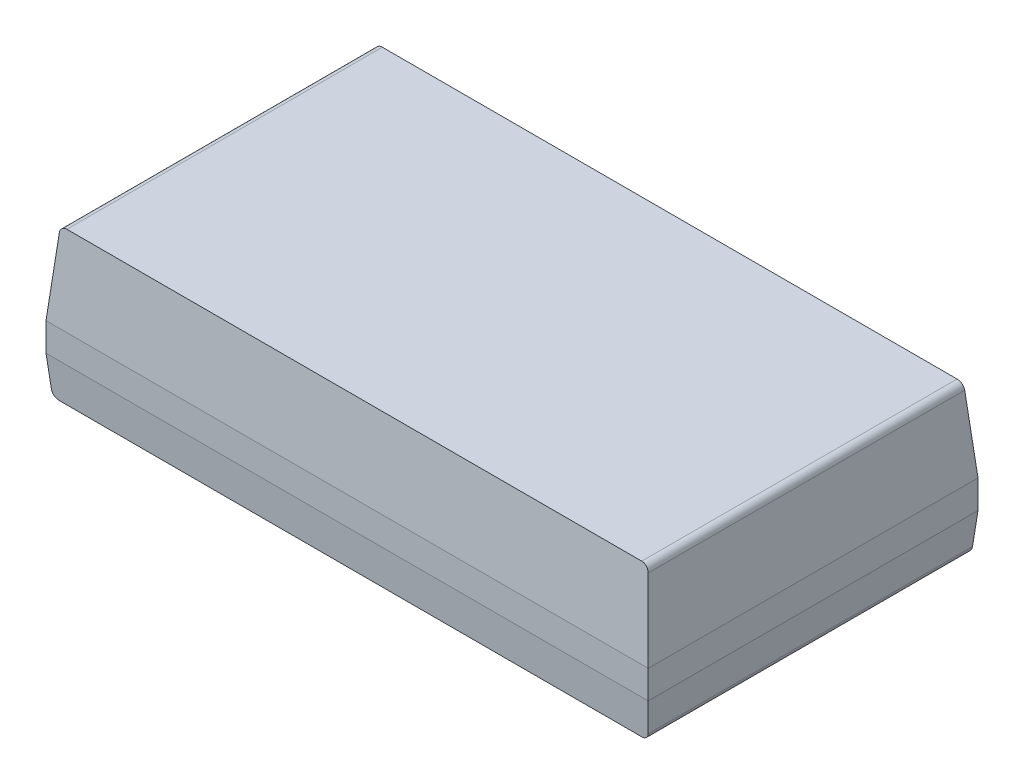
ISO-10303-21;
HEADER;
FILE_DESCRIPTION(('STEP AP214'),'2;1');
FILE_NAME('part.step','',(''),(''),'','','');
FILE_SCHEMA(('AUTOMOTIVE_DESIGN { 1 0 10303 214 1 1 1 1 }'));
ENDSEC;
DATA;
#1=APPLICATION_CONTEXT('core data for automotive mechanical design processes');
#2=APPLICATION_PROTOCOL_DEFINITION('international standard','automotive_design',2000,#1);
#3=PRODUCT_CONTEXT('',#1,'mechanical');
#4=PRODUCT('Part','Part','',(#3));
#5=PRODUCT_RELATED_PRODUCT_CATEGORY('part','',(#4));
#6=PRODUCT_DEFINITION_FORMATION('','',#4);
#7=PRODUCT_DEFINITION_CONTEXT('part definition',#1,'design');
#8=PRODUCT_DEFINITION('design','',#6,#7);
#9=PRODUCT_DEFINITION_SHAPE('','',#8);
#10=(LENGTH_UNIT() NAMED_UNIT(*) SI_UNIT(.MILLI.,.METRE.));
#11=(NAMED_UNIT(*) PLANE_ANGLE_UNIT() SI_UNIT($,.RADIAN.));
#12=(NAMED_UNIT(*) SI_UNIT($,.STERADIAN.) SOLID_ANGLE_UNIT());
#13=UNCERTAINTY_MEASURE_WITH_UNIT(LENGTH_MEASURE(1.E-05),#10,'distance_accuracy_value','');
#14=(GEOMETRIC_REPRESENTATION_CONTEXT(3) GLOBAL_UNCERTAINTY_ASSIGNED_CONTEXT((#13)) GLOBAL_UNIT_ASSIGNED_CONTEXT((#10,
#11,#12)) REPRESENTATION_CONTEXT('',''));
#15=CARTESIAN_POINT('',(0.,0.,0.));
#16=DIRECTION('',(0.,0.,1.));
#17=DIRECTION('',(1.,0.,0.));
#18=AXIS2_PLACEMENT_3D('',#15,#16,#17);
#19=CARTESIAN_POINT('',(3.144620171683,-0.635,-1.750530207678));
#20=DIRECTION('',(0.,0.,1.));
#21=DIRECTION('',(0.,-1.,0.));
#22=AXIS2_PLACEMENT_3D('',#19,#20,#21);
#23=CYLINDRICAL_SURFACE('',#22,0.0762);
#24=CARTESIAN_POINT('',(3.144620171683,-0.7112,-1.744444607143));
#25=CARTESIAN_POINT('',(3.14552926247137,-0.711200007989671,-1.74444461077123));
#26=CARTESIAN_POINT('',(3.14643835267123,-0.711183731742178,-1.74444662650876));
#27=CARTESIAN_POINT('',(3.14827267850951,-0.7111180471794,-1.74445454853415));
#28=CARTESIAN_POINT('',(3.14919789145972,-0.711068012994107,-1.74446052827713));
#29=CARTESIAN_POINT('',(3.15106315268364,-0.710932988511742,-1.74447637680073));
#30=CARTESIAN_POINT('',(3.15200315426333,-0.710847361067724,-1.7444863163221));
#31=CARTESIAN_POINT('',(3.15389654538788,-0.710639358312948,-1.74451008812636));
#32=CARTESIAN_POINT('',(3.15484986300863,-0.710516335806524,-1.74452398867355));
#33=CARTESIAN_POINT('',(3.15676829615674,-0.710231777489264,-1.74455568464156));
#34=CARTESIAN_POINT('',(3.15773331329392,-0.710069585467477,-1.74457354594824));
#35=CARTESIAN_POINT('',(3.15967340961391,-0.709704962990543,-1.74461316583401));
#36=CARTESIAN_POINT('',(3.16064836273586,-0.709501868519232,-1.74463498804597));
#37=CARTESIAN_POINT('',(3.16260644625884,-0.709053765607423,-1.74468253191471));
#38=CARTESIAN_POINT('',(3.16358942175246,-0.708808086634976,-1.74470831505983));
#39=CARTESIAN_POINT('',(3.16556151397584,-0.708273200143498,-1.74476378289146));
#40=CARTESIAN_POINT('',(3.16655044581484,-0.707983316974562,-1.74479352702592));
#41=CARTESIAN_POINT('',(3.16853226165661,-0.707358480030604,-1.7448569188241));
#42=CARTESIAN_POINT('',(3.16952492969481,-0.707022846988247,-1.74489062399246));
#43=CARTESIAN_POINT('',(3.17151187481962,-0.706305053004327,-1.74496193975456));
#44=CARTESIAN_POINT('',(3.17250590383241,-0.705922210784273,-1.74499960600099));
#45=CARTESIAN_POINT('',(3.17449307353311,-0.705108638686984,-1.74507884572632));
#46=CARTESIAN_POINT('',(3.17548593306627,-0.704677227232113,-1.7451204730918));
#47=CARTESIAN_POINT('',(3.17746811283836,-0.703765267736616,-1.74520763677932));
#48=CARTESIAN_POINT('',(3.17845711794283,-0.703284039637026,-1.74525322530262));
#49=CARTESIAN_POINT('',(3.1804287859051,-0.702271322520866,-1.74534831295155));
#50=CARTESIAN_POINT('',(3.1814110988324,-0.701739156886851,-1.74539786266914));
#51=CARTESIAN_POINT('',(3.18336643014466,-0.700623579163725,-1.74550087427877));
#52=CARTESIAN_POINT('',(3.184339063079,-0.700039495925132,-1.74555438522512));
#53=CARTESIAN_POINT('',(3.18627193650881,-0.698819250813627,-1.74566532079484));
#54=CARTESIAN_POINT('',(3.1872317554117,-0.698182425387038,-1.74572279300244));
#55=CARTESIAN_POINT('',(3.18913576220035,-0.696856031949704,-1.74584165253172));
#56=CARTESIAN_POINT('',(3.19007949184234,-0.696165810207328,-1.74590308603128));
#57=CARTESIAN_POINT('',(3.19194794701812,-0.694732143518703,-1.74602986951967));
#58=CARTESIAN_POINT('',(3.19287217727075,-0.693988056983643,-1.74609526434021));
#59=CARTESIAN_POINT('',(3.19469813355295,-0.692446378667421,-1.74622997178731));
#60=CARTESIAN_POINT('',(3.19559932701137,-0.691648159850814,-1.7462993279563));
#61=CARTESIAN_POINT('',(3.19737559144271,-0.689998148807689,-1.74644195936177));
#62=CARTESIAN_POINT('',(3.19825009244616,-0.689145746593696,-1.74651527690519));
#63=CARTESIAN_POINT('',(3.19996924588366,-0.687387529722196,-1.74666583226875));
#64=CARTESIAN_POINT('',(3.20081329099646,-0.68648112469714,-1.74674311121121));
#65=CARTESIAN_POINT('',(3.20246771058077,-0.684615307390292,-1.7469015905326));
#66=CARTESIAN_POINT('',(3.20327744059123,-0.683655327002439,-1.74698283089743));
#67=CARTESIAN_POINT('',(3.20485932530301,-0.681683023183496,-1.74714923417643));
#68=CARTESIAN_POINT('',(3.20563079879126,-0.680670156610182,-1.74723443598576));
#69=CARTESIAN_POINT('',(3.20713219818825,-0.67859301805093,-1.74740876322219));
#70=CARTESIAN_POINT('',(3.20786140670563,-0.677528230639828,-1.747497926497));
#71=CARTESIAN_POINT('',(3.20927425292057,-0.675348475286019,-1.74768017769073));
#72=CARTESIAN_POINT('',(3.20995713781794,-0.674233022428257,-1.74777330245097));
#73=CARTESIAN_POINT('',(3.21127328086761,-0.67195346143632,-1.74796347760179));
#74=CARTESIAN_POINT('',(3.21190575178529,-0.670788901717864,-1.74806056386629));
#75=CARTESIAN_POINT('',(3.21311699826148,-0.66841296489424,-1.74825866297438));
#76=CARTESIAN_POINT('',(3.21369495333954,-0.667201172370555,-1.74835971076152));
#77=CARTESIAN_POINT('',(3.21479310836931,-0.664732931667035,-1.74856573382573));
#78=CARTESIAN_POINT('',(3.21531245600383,-0.663476107068997,-1.74867074315115));
#79=CARTESIAN_POINT('',(3.2162893689465,-0.660920297849985,-1.74888469017546));
#80=CARTESIAN_POINT('',(3.21674605174436,-0.659620978630438,-1.74899366106105));
#81=CARTESIAN_POINT('',(3.21759366375469,-0.656983018114165,-1.74921553203002));
#82=CARTESIAN_POINT('',(3.21798368212283,-0.655644086822435,-1.74932846446998));
#83=CARTESIAN_POINT('',(3.21869408246087,-0.652930090224415,-1.74955825944203));
#84=CARTESIAN_POINT('',(3.21901352742826,-0.651554782269767,-1.74967515353218));
#85=CARTESIAN_POINT('',(3.21957899195392,-0.648771572833732,-1.74991287228497));
#86=CARTESIAN_POINT('',(3.21982405048754,-0.647363478687037,-1.7500337277312));
#87=CARTESIAN_POINT('',(3.22023716278541,-0.64451860425664,-1.75027937110996));
#88=CARTESIAN_POINT('',(3.220404234957,-0.643081683976086,-1.75040418909722));
#89=CARTESIAN_POINT('',(3.22053020767763,-0.641641267596967,-1.750530207678));
#90=B_SPLINE_CURVE_WITH_KNOTS('',3,(#24,#25,#26,#27,#28,#29,#30,#31,#32,#33,#34,#35,#36,#37,#38,
#39,#40,#41,#42,#43,#44,#45,#46,#47,#48,#49,#50,#51,#52,#53,#54,#55,#56,#57,#58,#59,#60,#61,#62,
#63,#64,#65,#66,#67,#68,#69,#70,#71,#72,#73,#74,#75,#76,#77,#78,#79,#80,#81,#82,#83,#84,#85,#86,
#87,#88,#89),.UNSPECIFIED.,.F.,.F.,(4,2,2,2,2,2,2,2,2,2,2,2,2,2,2,2,2,2,2,2,2,2,2,2,2,2,2,2,2,2,
2,2,4),(0.,0.0027271250410182,0.00550625304940302,0.008337431740304,0.0112207062212188,
0.0141561191745198,0.0171437110244235,0.0201835200899486,0.02327558272524,0.0264199334484728,
0.0296166050604253,0.0328656287536867,0.036167034213373,0.0395208497101124,0.0429271021860067,
0.0463858173341831,0.0498970196725011,0.0534607326119159,0.0570769785199553,0.0607457787797179,
0.0644671538447652,0.0682411232902451,0.0720677058605461,0.0759469195137649,0.0798787814632353,
0.0838633082163454,0.0879005156108546,0.0919904188488998,0.0961330325288617,0.100328370675252,
0.104576446766763,0.108877273762624,0.113230864127365),.UNSPECIFIED.);
#91=CARTESIAN_POINT('',(3.144620171683,-0.7112,-1.744444607143));
#92=VERTEX_POINT('',#91);
#93=CARTESIAN_POINT('',(3.220530207678,-0.641641267597,-1.750530207678));
#94=VERTEX_POINT('',#93);
#95=EDGE_CURVE('E374',#92,#94,#90,.T.);
#96=ORIENTED_EDGE('',*,*,#95,.T.);
#97=DIRECTION('',(0.,0.,1.));
#98=VECTOR('',#97,1.);
#99=CARTESIAN_POINT('',(3.220530207678,-0.641641267597,-1.750530207678));
#100=LINE('',#99,#98);
#101=CARTESIAN_POINT('',(3.220530207678,-0.641641267597,1.750530207678));
#102=VERTEX_POINT('',#101);
#103=EDGE_CURVE('E375',#94,#102,#100,.T.);
#104=ORIENTED_EDGE('',*,*,#103,.T.);
#105=CARTESIAN_POINT('',(3.144620171683,-0.711200000000006,1.74444460714307));
#106=CARTESIAN_POINT('',(3.17405171362827,-0.711200000000006,1.74444460714307));
#107=CARTESIAN_POINT('',(3.19613061111975,-0.691152601266991,1.74619852726539));
#108=CARTESIAN_POINT('',(3.21793026459007,-0.671358753067382,1.74793026459041));
#109=CARTESIAN_POINT('',(3.220530207678,-0.641641267596962,1.75053020767757));
#110=B_SPLINE_CURVE_WITH_KNOTS('',2,(#105,#106,#107,#108,#109),.UNSPECIFIED.,.F.,.F.,(3,2,3),
(0.,0.5,1.),.UNSPECIFIED.);
#111=CARTESIAN_POINT('',(3.144620171683,-0.7112,1.744444607143));
#112=VERTEX_POINT('',#111);
#113=EDGE_CURVE('E387',#112,#102,#110,.T.);
#114=ORIENTED_EDGE('',*,*,#113,.F.);
#115=DIRECTION('',(0.,0.,1.));
#116=VECTOR('',#115,1.);
#117=CARTESIAN_POINT('',(3.144620171683,-0.7112,-1.744444607143));
#118=LINE('',#117,#116);
#119=EDGE_CURVE('E11',#92,#112,#118,.T.);
#120=ORIENTED_EDGE('',*,*,#119,.F.);
#121=EDGE_LOOP('',(#96,#104,#114,#120));
#122=FACE_BOUND('',#121,.T.);
#123=ADVANCED_FACE('F17',(#122),#23,.T.);
#124=CARTESIAN_POINT('',(0.,-0.7112,0.));
#125=DIRECTION('',(0.,-1.,0.));
#126=DIRECTION('',(0.,0.,-1.));
#127=AXIS2_PLACEMENT_3D('',#124,#125,#126);
#128=PLANE('',#127);
#129=DIRECTION('',(-1.,0.,0.));
#130=VECTOR('',#129,1.);
#131=CARTESIAN_POINT('',(3.144620171683,-0.7112,1.744444607143));
#132=LINE('',#131,#130);
#133=CARTESIAN_POINT('',(-3.144620171683,-0.7112,1.744444607143));
#134=VERTEX_POINT('',#133);
#135=EDGE_CURVE('E400',#112,#134,#132,.T.);
#136=ORIENTED_EDGE('',*,*,#135,.T.);
#137=DIRECTION('',(0.,0.,-1.));
#138=VECTOR('',#137,1.);
#139=CARTESIAN_POINT('',(-3.144620171683,-0.7112,1.744444607143));
#140=LINE('',#139,#138);
#141=CARTESIAN_POINT('',(-3.144620171683,-0.7112,-1.744444607143));
#142=VERTEX_POINT('',#141);
#143=EDGE_CURVE('E27',#134,#142,#140,.T.);
#144=ORIENTED_EDGE('',*,*,#143,.T.);
#145=DIRECTION('',(1.,0.,0.));
#146=VECTOR('',#145,1.);
#147=CARTESIAN_POINT('',(-3.144620171683,-0.7112,-1.744444607143));
#148=LINE('',#147,#146);
#149=EDGE_CURVE('E446',#142,#92,#148,.T.);
#150=ORIENTED_EDGE('',*,*,#149,.T.);
#151=ORIENTED_EDGE('',*,*,#119,.T.);
#152=EDGE_LOOP('',(#136,#144,#150,#151));
#153=FACE_BOUND('',#152,.T.);
#154=ADVANCED_FACE('F432',(#153),#128,.T.);
#155=CARTESIAN_POINT('',(-3.144620171683,-0.635,1.750530207678));
#156=DIRECTION('',(0.,0.,-1.));
#157=DIRECTION('',(0.,-1.,0.));
#158=AXIS2_PLACEMENT_3D('',#155,#156,#157);
#159=CYLINDRICAL_SURFACE('',#158,0.0762);
#160=CARTESIAN_POINT('',(-3.144620171683,-0.7112,1.744444607143));
#161=CARTESIAN_POINT('',(-3.14552926247137,-0.711200007989671,1.74444461077123));
#162=CARTESIAN_POINT('',(-3.14643835267123,-0.711183731742178,1.74444662650876));
#163=CARTESIAN_POINT('',(-3.14827267850951,-0.7111180471794,1.74445454853415));
#164=CARTESIAN_POINT('',(-3.14919789145972,-0.711068012994107,1.74446052827713));
#165=CARTESIAN_POINT('',(-3.15106315268364,-0.710932988511742,1.74447637680073));
#166=CARTESIAN_POINT('',(-3.15200315426333,-0.710847361067724,1.7444863163221));
#167=CARTESIAN_POINT('',(-3.15389654538788,-0.710639358312948,1.74451008812636));
#168=CARTESIAN_POINT('',(-3.15484986300863,-0.710516335806524,1.74452398867355));
#169=CARTESIAN_POINT('',(-3.15676829615674,-0.710231777489264,1.74455568464156));
#170=CARTESIAN_POINT('',(-3.15773331329392,-0.710069585467477,1.74457354594824));
#171=CARTESIAN_POINT('',(-3.15967340961391,-0.709704962990543,1.74461316583401));
#172=CARTESIAN_POINT('',(-3.16064836273586,-0.709501868519232,1.74463498804597));
#173=CARTESIAN_POINT('',(-3.16260644625884,-0.709053765607423,1.74468253191471));
#174=CARTESIAN_POINT('',(-3.16358942175246,-0.708808086634976,1.74470831505983));
#175=CARTESIAN_POINT('',(-3.16556151397584,-0.708273200143498,1.74476378289146));
#176=CARTESIAN_POINT('',(-3.16655044581484,-0.707983316974562,1.74479352702592));
#177=CARTESIAN_POINT('',(-3.16853226165661,-0.707358480030604,1.7448569188241));
#178=CARTESIAN_POINT('',(-3.16952492969481,-0.707022846988247,1.74489062399246));
#179=CARTESIAN_POINT('',(-3.17151187481962,-0.706305053004327,1.74496193975456));
#180=CARTESIAN_POINT('',(-3.17250590383241,-0.705922210784273,1.74499960600099));
#181=CARTESIAN_POINT('',(-3.17449307353311,-0.705108638686984,1.74507884572632));
#182=CARTESIAN_POINT('',(-3.17548593306627,-0.704677227232113,1.7451204730918));
#183=CARTESIAN_POINT('',(-3.17746811283836,-0.703765267736616,1.74520763677932));
#184=CARTESIAN_POINT('',(-3.17845711794283,-0.703284039637026,1.74525322530262));
#185=CARTESIAN_POINT('',(-3.1804287859051,-0.702271322520866,1.74534831295155));
#186=CARTESIAN_POINT('',(-3.1814110988324,-0.701739156886851,1.74539786266914));
#187=CARTESIAN_POINT('',(-3.18336643014466,-0.700623579163725,1.74550087427877));
#188=CARTESIAN_POINT('',(-3.184339063079,-0.700039495925132,1.74555438522512));
#189=CARTESIAN_POINT('',(-3.18627193650881,-0.698819250813627,1.74566532079484));
#190=CARTESIAN_POINT('',(-3.1872317554117,-0.698182425387038,1.74572279300244));
#191=CARTESIAN_POINT('',(-3.18913576220035,-0.696856031949704,1.74584165253172));
#192=CARTESIAN_POINT('',(-3.19007949184234,-0.696165810207328,1.74590308603128));
#193=CARTESIAN_POINT('',(-3.19194794701812,-0.694732143518703,1.74602986951967));
#194=CARTESIAN_POINT('',(-3.19287217727075,-0.693988056983643,1.74609526434021));
#195=CARTESIAN_POINT('',(-3.19469813355295,-0.692446378667421,1.74622997178731));
#196=CARTESIAN_POINT('',(-3.19559932701137,-0.691648159850814,1.7462993279563));
#197=CARTESIAN_POINT('',(-3.19737559144271,-0.689998148807689,1.74644195936177));
#198=CARTESIAN_POINT('',(-3.19825009244616,-0.689145746593696,1.74651527690519));
#199=CARTESIAN_POINT('',(-3.19996924588366,-0.687387529722196,1.74666583226875));
#200=CARTESIAN_POINT('',(-3.20081329099646,-0.68648112469714,1.74674311121121));
#201=CARTESIAN_POINT('',(-3.20246771058077,-0.684615307390292,1.7469015905326));
#202=CARTESIAN_POINT('',(-3.20327744059123,-0.683655327002439,1.74698283089743));
#203=CARTESIAN_POINT('',(-3.20485932530301,-0.681683023183496,1.74714923417643));
#204=CARTESIAN_POINT('',(-3.20563079879126,-0.680670156610182,1.74723443598576));
#205=CARTESIAN_POINT('',(-3.20713219818825,-0.67859301805093,1.74740876322219));
#206=CARTESIAN_POINT('',(-3.20786140670563,-0.677528230639828,1.747497926497));
#207=CARTESIAN_POINT('',(-3.20927425292057,-0.675348475286019,1.74768017769073));
#208=CARTESIAN_POINT('',(-3.20995713781794,-0.674233022428257,1.74777330245097));
#209=CARTESIAN_POINT('',(-3.21127328086761,-0.67195346143632,1.74796347760179));
#210=CARTESIAN_POINT('',(-3.21190575178529,-0.670788901717864,1.74806056386629));
#211=CARTESIAN_POINT('',(-3.21311699826148,-0.66841296489424,1.74825866297438));
#212=CARTESIAN_POINT('',(-3.21369495333954,-0.667201172370555,1.74835971076152));
#213=CARTESIAN_POINT('',(-3.21479310836931,-0.664732931667035,1.74856573382573));
#214=CARTESIAN_POINT('',(-3.21531245600383,-0.663476107068997,1.74867074315115));
#215=CARTESIAN_POINT('',(-3.2162893689465,-0.660920297849985,1.74888469017546));
#216=CARTESIAN_POINT('',(-3.21674605174436,-0.659620978630438,1.74899366106105));
#217=CARTESIAN_POINT('',(-3.21759366375469,-0.656983018114165,1.74921553203002));
#218=CARTESIAN_POINT('',(-3.21798368212283,-0.655644086822435,1.74932846446998));
#219=CARTESIAN_POINT('',(-3.21869408246087,-0.652930090224415,1.74955825944203));
#220=CARTESIAN_POINT('',(-3.21901352742826,-0.651554782269767,1.74967515353218));
#221=CARTESIAN_POINT('',(-3.21957899195392,-0.648771572833732,1.74991287228497));
#222=CARTESIAN_POINT('',(-3.21982405048754,-0.647363478687037,1.7500337277312));
#223=CARTESIAN_POINT('',(-3.22023716278541,-0.64451860425664,1.75027937110996));
#224=CARTESIAN_POINT('',(-3.220404234957,-0.643081683976086,1.75040418909722));
#225=CARTESIAN_POINT('',(-3.22053020767763,-0.641641267596967,1.750530207678));
#226=B_SPLINE_CURVE_WITH_KNOTS('',3,(#160,#161,#162,#163,#164,#165,#166,#167,#168,#169,#170,
#171,#172,#173,#174,#175,#176,#177,#178,#179,#180,#181,#182,#183,#184,#185,#186,#187,#188,#189,
#190,#191,#192,#193,#194,#195,#196,#197,#198,#199,#200,#201,#202,#203,#204,#205,#206,#207,#208,
#209,#210,#211,#212,#213,#214,#215,#216,#217,#218,#219,#220,#221,#222,#223,#224,#225),
.UNSPECIFIED.,.F.,.F.,(4,2,2,2,2,2,2,2,2,2,2,2,2,2,2,2,2,2,2,2,2,2,2,2,2,2,2,2,2,2,2,2,4),(0.,
0.0027271250410182,0.00550625304940302,0.008337431740304,0.0112207062212188,0.0141561191745198,
0.0171437110244235,0.0201835200899486,0.02327558272524,0.0264199334484728,0.0296166050604253,
0.0328656287536867,0.036167034213373,0.0395208497101124,0.0429271021860067,0.0463858173341831,
0.0498970196725011,0.0534607326119159,0.0570769785199553,0.0607457787797179,0.0644671538447652,
0.0682411232902451,0.0720677058605461,0.0759469195137649,0.0798787814632353,0.0838633082163454,
0.0879005156108546,0.0919904188488998,0.0961330325288617,0.100328370675252,0.104576446766763,
0.108877273762624,0.113230864127365),.UNSPECIFIED.);
#227=CARTESIAN_POINT('',(-3.220530207678,-0.641641267597,1.750530207678));
#228=VERTEX_POINT('',#227);
#229=EDGE_CURVE('E408',#134,#228,#226,.T.);
#230=ORIENTED_EDGE('',*,*,#229,.T.);
#231=DIRECTION('',(0.,0.,-1.));
#232=VECTOR('',#231,1.);
#233=CARTESIAN_POINT('',(-3.220530207678,-0.641641267597,1.750530207678));
#234=LINE('',#233,#232);
#235=CARTESIAN_POINT('',(-3.220530207678,-0.641641267597,-1.750530207678));
#236=VERTEX_POINT('',#235);
#237=EDGE_CURVE('E451',#228,#236,#234,.T.);
#238=ORIENTED_EDGE('',*,*,#237,.T.);
#239=CARTESIAN_POINT('',(-3.144620171683,-0.711200000000006,-1.74444460714307));
#240=CARTESIAN_POINT('',(-3.17405171362827,-0.711200000000006,-1.74444460714307));
#241=CARTESIAN_POINT('',(-3.19613061111975,-0.691152601266991,-1.74619852726539));
#242=CARTESIAN_POINT('',(-3.21793026459007,-0.671358753067382,-1.74793026459041));
#243=CARTESIAN_POINT('',(-3.220530207678,-0.641641267596962,-1.75053020767757));
#244=B_SPLINE_CURVE_WITH_KNOTS('',2,(#239,#240,#241,#242,#243),.UNSPECIFIED.,.F.,.F.,(3,2,3),
(0.,0.5,1.),.UNSPECIFIED.);
#245=EDGE_CURVE('E331',#142,#236,#244,.T.);
#246=ORIENTED_EDGE('',*,*,#245,.F.);
#247=ORIENTED_EDGE('',*,*,#143,.F.);
#248=EDGE_LOOP('',(#230,#238,#246,#247));
#249=FACE_BOUND('',#248,.T.);
#250=ADVANCED_FACE('F349',(#249),#159,.T.);
#251=CARTESIAN_POINT('',(-3.25,-0.3048,-1.78));
#252=DIRECTION('',(0.,-0.0871557427476379,-0.996194698091747));
#253=DIRECTION('',(0.,-0.996194698091747,0.0871557427476379));
#254=AXIS2_PLACEMENT_3D('',#251,#252,#253);
#255=PLANE('',#254);
#256=DIRECTION('',(-0.0868265938642471,-0.992432509138967,0.0868265938642471));
#257=VECTOR('',#256,1.);
#258=CARTESIAN_POINT('',(3.25,-0.3048,-1.78));
#259=LINE('',#258,#257);
#260=CARTESIAN_POINT('',(3.25,-0.3048,-1.78));
#261=VERTEX_POINT('',#260);
#262=EDGE_CURVE('E370',#261,#94,#259,.T.);
#263=ORIENTED_EDGE('',*,*,#262,.T.);
#264=ORIENTED_EDGE('',*,*,#95,.F.);
#265=ORIENTED_EDGE('',*,*,#149,.F.);
#266=ORIENTED_EDGE('',*,*,#245,.T.);
#267=DIRECTION('',(0.0868265938642471,-0.992432509138967,0.0868265938642471));
#268=VECTOR('',#267,1.);
#269=CARTESIAN_POINT('',(-3.25,-0.3048,-1.78));
#270=LINE('',#269,#268);
#271=CARTESIAN_POINT('',(-3.25,-0.3048,-1.78));
#272=VERTEX_POINT('',#271);
#273=EDGE_CURVE('E455',#272,#236,#270,.T.);
#274=ORIENTED_EDGE('',*,*,#273,.F.);
#275=DIRECTION('',(-1.,0.,0.));
#276=VECTOR('',#275,1.);
#277=CARTESIAN_POINT('',(3.25,-0.3048,-1.78));
#278=LINE('',#277,#276);
#279=EDGE_CURVE('E313',#261,#272,#278,.T.);
#280=ORIENTED_EDGE('',*,*,#279,.F.);
#281=EDGE_LOOP('',(#263,#264,#265,#266,#274,#280));
#282=FACE_BOUND('',#281,.T.);
#283=ADVANCED_FACE('F338',(#282),#255,.T.);
#284=CARTESIAN_POINT('',(3.25,-0.3048,-1.78));
#285=DIRECTION('',(0.996194698091747,-0.0871557427476379,0.));
#286=DIRECTION('',(0.,0.,-1.));
#287=AXIS2_PLACEMENT_3D('',#284,#285,#286);
#288=PLANE('',#287);
#289=DIRECTION('',(-0.0868265938642471,-0.992432509138967,-0.0868265938642471));
#290=VECTOR('',#289,1.);
#291=CARTESIAN_POINT('',(3.25,-0.3048,1.78));
#292=LINE('',#291,#290);
#293=CARTESIAN_POINT('',(3.25,-0.3048,1.78));
#294=VERTEX_POINT('',#293);
#295=EDGE_CURVE('E380',#294,#102,#292,.T.);
#296=ORIENTED_EDGE('',*,*,#295,.T.);
#297=ORIENTED_EDGE('',*,*,#103,.F.);
#298=ORIENTED_EDGE('',*,*,#262,.F.);
#299=DIRECTION('',(0.,0.,-1.));
#300=VECTOR('',#299,1.);
#301=CARTESIAN_POINT('',(3.25,-0.3048,1.78));
#302=LINE('',#301,#300);
#303=EDGE_CURVE('E308',#294,#261,#302,.T.);
#304=ORIENTED_EDGE('',*,*,#303,.F.);
#305=EDGE_LOOP('',(#296,#297,#298,#304));
#306=FACE_BOUND('',#305,.T.);
#307=ADVANCED_FACE('F348',(#306),#288,.T.);
#308=CARTESIAN_POINT('',(3.25,-0.3048,1.78));
#309=DIRECTION('',(0.,-0.0871557427476379,0.996194698091747));
#310=DIRECTION('',(-1.,0.,0.));
#311=AXIS2_PLACEMENT_3D('',#308,#309,#310);
#312=PLANE('',#311);
#313=DIRECTION('',(0.0868265938642471,-0.992432509138967,-0.0868265938642471));
#314=VECTOR('',#313,1.);
#315=CARTESIAN_POINT('',(-3.25,-0.3048,1.78));
#316=LINE('',#315,#314);
#317=CARTESIAN_POINT('',(-3.25,-0.3048,1.78));
#318=VERTEX_POINT('',#317);
#319=EDGE_CURVE('E454',#318,#228,#316,.T.);
#320=ORIENTED_EDGE('',*,*,#319,.T.);
#321=ORIENTED_EDGE('',*,*,#229,.F.);
#322=ORIENTED_EDGE('',*,*,#135,.F.);
#323=ORIENTED_EDGE('',*,*,#113,.T.);
#324=ORIENTED_EDGE('',*,*,#295,.F.);
#325=DIRECTION('',(-1.,0.,0.));
#326=VECTOR('',#325,1.);
#327=CARTESIAN_POINT('',(3.25,-0.3048,1.78));
#328=LINE('',#327,#326);
#329=EDGE_CURVE('E479',#294,#318,#328,.T.);
#330=ORIENTED_EDGE('',*,*,#329,.T.);
#331=EDGE_LOOP('',(#320,#321,#322,#323,#324,#330));
#332=FACE_BOUND('',#331,.T.);
#333=ADVANCED_FACE('F352',(#332),#312,.T.);
#334=CARTESIAN_POINT('',(-3.25,-0.3048,1.78));
#335=DIRECTION('',(-0.996194698091747,-0.0871557427476379,0.));
#336=DIRECTION('',(-0.0871557427476379,0.996194698091747,0.));
#337=AXIS2_PLACEMENT_3D('',#334,#335,#336);
#338=PLANE('',#337);
#339=ORIENTED_EDGE('',*,*,#273,.T.);
#340=ORIENTED_EDGE('',*,*,#237,.F.);
#341=ORIENTED_EDGE('',*,*,#319,.F.);
#342=DIRECTION('',(0.,0.,-1.));
#343=VECTOR('',#342,1.);
#344=CARTESIAN_POINT('',(-3.25,-0.3048,1.78));
#345=LINE('',#344,#343);
#346=EDGE_CURVE('E323',#318,#272,#345,.T.);
#347=ORIENTED_EDGE('',*,*,#346,.T.);
#348=EDGE_LOOP('',(#339,#340,#341,#347));
#349=FACE_BOUND('',#348,.T.);
#350=ADVANCED_FACE('F350',(#349),#338,.T.);
#351=CARTESIAN_POINT('',(-3.25,0.,-1.78));
#352=DIRECTION('',(-0.996194698091747,0.0871557427476379,0.));
#353=DIRECTION('',(0.,0.,1.));
#354=AXIS2_PLACEMENT_3D('',#351,#352,#353);
#355=PLANE('',#354);
#356=DIRECTION('',(0.0868265938642471,0.992432509138967,-0.0868265938642471));
#357=VECTOR('',#356,1.);
#358=CARTESIAN_POINT('',(-3.25,0.,1.78));
#359=LINE('',#358,#357);
#360=CARTESIAN_POINT('',(-3.25,0.,1.78));
#361=VERTEX_POINT('',#360);
#362=CARTESIAN_POINT('',(-3.17830817866,0.819441267597,1.70830817866));
#363=VERTEX_POINT('',#362);
#364=EDGE_CURVE('E151',#361,#363,#359,.T.);
#365=ORIENTED_EDGE('',*,*,#364,.T.);
#366=DIRECTION('',(0.,0.,1.));
#367=VECTOR('',#366,1.);
#368=CARTESIAN_POINT('',(-3.17830817866,0.819441267597,-1.70830817866));
#369=LINE('',#368,#367);
#370=CARTESIAN_POINT('',(-3.17830817866,0.819441267597,-1.70830817866));
#371=VERTEX_POINT('',#370);
#372=EDGE_CURVE('E509',#371,#363,#369,.T.);
#373=ORIENTED_EDGE('',*,*,#372,.F.);
#374=DIRECTION('',(0.0868265938642471,0.992432509138967,0.0868265938642471));
#375=VECTOR('',#374,1.);
#376=CARTESIAN_POINT('',(-3.25,0.,-1.78));
#377=LINE('',#376,#375);
#378=CARTESIAN_POINT('',(-3.25,0.,-1.78));
#379=VERTEX_POINT('',#378);
#380=EDGE_CURVE('E236',#379,#371,#377,.T.);
#381=ORIENTED_EDGE('',*,*,#380,.F.);
#382=DIRECTION('',(0.,0.,-1.));
#383=VECTOR('',#382,1.);
#384=CARTESIAN_POINT('',(-3.25,0.,1.78));
#385=LINE('',#384,#383);
#386=EDGE_CURVE('E327',#361,#379,#385,.T.);
#387=ORIENTED_EDGE('',*,*,#386,.F.);
#388=EDGE_LOOP('',(#365,#373,#381,#387));
#389=FACE_BOUND('',#388,.T.);
#390=ADVANCED_FACE('F249',(#389),#355,.T.);
#391=CARTESIAN_POINT('',(-3.25,0.,-1.78));
#392=DIRECTION('',(-1.,0.,0.));
#393=DIRECTION('',(0.,0.,1.));
#394=AXIS2_PLACEMENT_3D('',#391,#392,#393);
#395=PLANE('',#394);
#396=DIRECTION('',(0.,-1.,0.));
#397=VECTOR('',#396,1.);
#398=CARTESIAN_POINT('',(-3.25,0.,-1.78));
#399=LINE('',#398,#397);
#400=EDGE_CURVE('E316',#379,#272,#399,.T.);
#401=ORIENTED_EDGE('',*,*,#400,.T.);
#402=ORIENTED_EDGE('',*,*,#346,.F.);
#403=DIRECTION('',(0.,-1.,0.));
#404=VECTOR('',#403,1.);
#405=CARTESIAN_POINT('',(-3.25,0.,1.78));
#406=LINE('',#405,#404);
#407=EDGE_CURVE('E485',#361,#318,#406,.T.);
#408=ORIENTED_EDGE('',*,*,#407,.F.);
#409=ORIENTED_EDGE('',*,*,#386,.T.);
#410=EDGE_LOOP('',(#401,#402,#408,#409));
#411=FACE_BOUND('',#410,.T.);
#412=ADVANCED_FACE('F503',(#411),#395,.T.);
#413=CARTESIAN_POINT('',(3.25,0.,-1.78));
#414=DIRECTION('',(0.,0.,-1.));
#415=DIRECTION('',(0.,-1.,0.));
#416=AXIS2_PLACEMENT_3D('',#413,#414,#415);
#417=PLANE('',#416);
#418=DIRECTION('',(0.,-1.,0.));
#419=VECTOR('',#418,1.);
#420=CARTESIAN_POINT('',(3.25,0.,-1.78));
#421=LINE('',#420,#419);
#422=CARTESIAN_POINT('',(3.25,0.,-1.78));
#423=VERTEX_POINT('',#422);
#424=EDGE_CURVE('E301',#423,#261,#421,.T.);
#425=ORIENTED_EDGE('',*,*,#424,.T.);
#426=ORIENTED_EDGE('',*,*,#279,.T.);
#427=ORIENTED_EDGE('',*,*,#400,.F.);
#428=DIRECTION('',(1.,0.,0.));
#429=VECTOR('',#428,1.);
#430=CARTESIAN_POINT('',(-3.25,0.,-1.78));
#431=LINE('',#430,#429);
#432=EDGE_CURVE('E317',#379,#423,#431,.T.);
#433=ORIENTED_EDGE('',*,*,#432,.T.);
#434=EDGE_LOOP('',(#425,#426,#427,#433));
#435=FACE_BOUND('',#434,.T.);
#436=ADVANCED_FACE('F247',(#435),#417,.T.);
#437=CARTESIAN_POINT('',(3.25,0.,-1.78));
#438=DIRECTION('',(0.,0.0871557427476379,-0.996194698091747));
#439=DIRECTION('',(-1.,0.,0.));
#440=AXIS2_PLACEMENT_3D('',#437,#438,#439);
#441=PLANE('',#440);
#442=ORIENTED_EDGE('',*,*,#380,.T.);
#443=CARTESIAN_POINT('',(-3.102398142665,0.889,-1.702222578125));
#444=CARTESIAN_POINT('',(-3.10330723345268,0.889000007989671,-1.70222258175323));
#445=CARTESIAN_POINT('',(-3.10421632365185,0.888983731742203,-1.70222459749076));
#446=CARTESIAN_POINT('',(-3.10605064948879,0.888918047179522,-1.70223251951615));
#447=CARTESIAN_POINT('',(-3.10697586243836,0.888868012994302,-1.70223849925913));
#448=CARTESIAN_POINT('',(-3.10884112366104,0.888732988512124,-1.70225434778273));
#449=CARTESIAN_POINT('',(-3.10978112524014,0.888647361068222,-1.7022642873041));
#450=CARTESIAN_POINT('',(-3.11167451636355,0.888439358313717,-1.70228805910836));
#451=CARTESIAN_POINT('',(-3.11262783398376,0.888316335807447,-1.70230195965555));
#452=CARTESIAN_POINT('',(-3.11454626713084,0.888031777490533,-1.70233365562356));
#453=CARTESIAN_POINT('',(-3.11551128426753,0.887869585468935,-1.70235151693024));
#454=CARTESIAN_POINT('',(-3.1174513805866,0.887504962992412,-1.70239113681601));
#455=CARTESIAN_POINT('',(-3.11842633370812,0.887301868521321,-1.70241295902797));
#456=CARTESIAN_POINT('',(-3.12038441723029,0.886853765609979,-1.70246050289671));
#457=CARTESIAN_POINT('',(-3.12136739272353,0.886608086637778,-1.70248628604183));
#458=CARTESIAN_POINT('',(-3.12333948494623,0.886073200146812,-1.70254175387346));
#459=CARTESIAN_POINT('',(-3.12432841678491,0.885783316978142,-1.70257149800792));
#460=CARTESIAN_POINT('',(-3.1263102326261,0.885158480034732,-1.7026348898061));
#461=CARTESIAN_POINT('',(-3.12730290066404,0.884822846992656,-1.70266859497446));
#462=CARTESIAN_POINT('',(-3.1292898457884,0.884105053009309,-1.70273991073656));
#463=CARTESIAN_POINT('',(-3.13028387480099,0.883722210789545,-1.70277757698299));
#464=CARTESIAN_POINT('',(-3.13227104450136,0.882908638692842,-1.70285681670832));
#465=CARTESIAN_POINT('',(-3.13326390403437,0.882477227238266,-1.7028984440738));
#466=CARTESIAN_POINT('',(-3.13524608380624,0.881565267743357,-1.70298560776132));
#467=CARTESIAN_POINT('',(-3.13623508891063,0.881084039644059,-1.70303119628462));
#468=CARTESIAN_POINT('',(-3.13820675687279,0.880071322528477,-1.70312628393355));
#469=CARTESIAN_POINT('',(-3.13918906980007,0.879539156894746,-1.70317583365115));
#470=CARTESIAN_POINT('',(-3.14114440111234,0.878423579172176,-1.70327884526078));
#471=CARTESIAN_POINT('',(-3.14211703404672,0.877839495933853,-1.70333235620712));
#472=CARTESIAN_POINT('',(-3.14404990747664,0.87661925082287,-1.70344329177684));
#473=CARTESIAN_POINT('',(-3.14500972637962,0.875982425396532,-1.70350076398444));
#474=CARTESIAN_POINT('',(-3.14691373316849,0.874656031959675,-1.70361962351372));
#475=CARTESIAN_POINT('',(-3.14785746281062,0.873965810217524,-1.70368105701328));
#476=CARTESIAN_POINT('',(-3.14972591798672,0.872532143529319,-1.70380784050167));
#477=CARTESIAN_POINT('',(-3.15065014823954,0.871788056994451,-1.70387323532221));
#478=CARTESIAN_POINT('',(-3.15247610452215,0.870246378678581,-1.70400794276931));
#479=CARTESIAN_POINT('',(-3.1533772979808,0.86944815986213,-1.7040772989383));
#480=CARTESIAN_POINT('',(-3.15515356241264,0.867798148819276,-1.70421993034378));
#481=CARTESIAN_POINT('',(-3.15602806341635,0.866945746605397,-1.7042932478872));
#482=CARTESIAN_POINT('',(-3.15774721685442,0.865187529734078,-1.70444380325075));
#483=CARTESIAN_POINT('',(-3.15859126196752,0.864281124709088,-1.70452108219322));
#484=CARTESIAN_POINT('',(-3.16024568155246,0.862415307402322,-1.7046795615146));
#485=CARTESIAN_POINT('',(-3.16105541156324,0.861455327014483,-1.70476080187944));
#486=CARTESIAN_POINT('',(-3.1626372962757,0.859483023195512,-1.70492720515843));
#487=CARTESIAN_POINT('',(-3.16340876976431,0.858470156622156,-1.70501240696777));
#488=CARTESIAN_POINT('',(-3.16491016916201,0.85639301806276,-1.7051867342042));
#489=CARTESIAN_POINT('',(-3.16563937767975,0.855328230651555,-1.705275897479));
#490=CARTESIAN_POINT('',(-3.16705222389542,0.85314847529748,-1.70545814867273));
#491=CARTESIAN_POINT('',(-3.16773510879317,0.852033022439552,-1.70555127343297));
#492=CARTESIAN_POINT('',(-3.16905125184358,0.849753461447218,-1.70574144858379));
#493=CARTESIAN_POINT('',(-3.16968372276163,0.848588901728531,-1.70583853484829));
#494=CARTESIAN_POINT('',(-3.17089496923854,0.846212964904379,-1.70603663395638));
#495=CARTESIAN_POINT('',(-3.17147292431696,0.845001172380395,-1.70613768174352));
#496=CARTESIAN_POINT('',(-3.17257107934744,0.842532931676211,-1.70634370480773));
#497=CARTESIAN_POINT('',(-3.17309042698229,0.841276107077806,-1.70644871413315));
#498=CARTESIAN_POINT('',(-3.17406733992561,0.838720297857995,-1.70666266115746));
#499=CARTESIAN_POINT('',(-3.17452402272378,0.837420978638012,-1.70677163204305));
#500=CARTESIAN_POINT('',(-3.1753716347347,0.834783018120804,-1.70699350301202));
#501=CARTESIAN_POINT('',(-3.17576165310311,0.833444086828573,-1.70710643545198));
#502=CARTESIAN_POINT('',(-3.17647205344165,0.830730090229487,-1.70733623042404));
#503=CARTESIAN_POINT('',(-3.17679149840927,0.829354782274273,-1.70745312451418));
#504=CARTESIAN_POINT('',(-3.17735696293532,0.826571572837045,-1.70769084326697));
#505=CARTESIAN_POINT('',(-3.17760202146911,0.825163478689722,-1.7078116987132));
#506=CARTESIAN_POINT('',(-3.17801513376725,0.822318604258013,-1.70805734209196));
#507=CARTESIAN_POINT('',(-3.17818220593893,0.820881683976774,-1.70818216007922));
#508=CARTESIAN_POINT('',(-3.17830817865963,0.819441267596967,-1.70830817866));
#509=B_SPLINE_CURVE_WITH_KNOTS('',3,(#443,#444,#445,#446,#447,#448,#449,#450,#451,#452,#453,
#454,#455,#456,#457,#458,#459,#460,#461,#462,#463,#464,#465,#466,#467,#468,#469,#470,#471,#472,
#473,#474,#475,#476,#477,#478,#479,#480,#481,#482,#483,#484,#485,#486,#487,#488,#489,#490,#491,
#492,#493,#494,#495,#496,#497,#498,#499,#500,#501,#502,#503,#504,#505,#506,#507,#508),
.UNSPECIFIED.,.F.,.F.,(4,2,2,2,2,2,2,2,2,2,2,2,2,2,2,2,2,2,2,2,2,2,2,2,2,2,2,2,2,2,2,2,4),(0.,
0.00272712503894638,0.00550625304539298,0.00833743173448936,0.0112207062137334,
0.0141561191654975,0.0171437110139979,0.0201835200782532,0.023275582712409,0.0264199334346401,
0.0296166050457242,0.0328656287382512,0.0361670341973363,0.0395208496936085,0.0429271021691689,
0.046385817317145,0.0498970196553964,0.0534607325948778,0.0570769785031172,0.0607457787632134,
0.0644671538287276,0.0682411232748079,0.0720677058458421,0.075946919499928,0.079878781450398,
0.083863308204641,0.0879005156004163,0.0919904188398608,0.0961330325213547,0.10032837066941,
0.10457644676272,0.108877273760512,0.113230864127316),.UNSPECIFIED.);
#510=CARTESIAN_POINT('',(-3.102398142665,0.889,-1.702222578125));
#511=VERTEX_POINT('',#510);
#512=EDGE_CURVE('E232',#511,#371,#509,.T.);
#513=ORIENTED_EDGE('',*,*,#512,.F.);
#514=DIRECTION('',(-1.,0.,0.));
#515=VECTOR('',#514,1.);
#516=CARTESIAN_POINT('',(3.102398142665,0.889,-1.702222578125));
#517=LINE('',#516,#515);
#518=CARTESIAN_POINT('',(3.102398142665,0.889,-1.702222578125));
#519=VERTEX_POINT('',#518);
#520=EDGE_CURVE('E163',#519,#511,#517,.T.);
#521=ORIENTED_EDGE('',*,*,#520,.F.);
#522=CARTESIAN_POINT('',(3.102398142665,0.889000000000041,-1.70222257812547));
#523=CARTESIAN_POINT('',(3.13182968461077,0.889000000000041,-1.70222257812547));
#524=CARTESIAN_POINT('',(3.15390858210275,0.868952601266507,-1.70397649824784));
#525=CARTESIAN_POINT('',(3.17570823557342,0.849158753066514,-1.70570823557289));
#526=CARTESIAN_POINT('',(3.17830817866,0.819441267596997,-1.70830817865997));
#527=B_SPLINE_CURVE_WITH_KNOTS('',2,(#522,#523,#524,#525,#526),.UNSPECIFIED.,.F.,.F.,(3,2,3),
(0.,0.5,1.),.UNSPECIFIED.);
#528=CARTESIAN_POINT('',(3.17830817866,0.819441267597,-1.70830817866));
#529=VERTEX_POINT('',#528);
#530=EDGE_CURVE('E157',#519,#529,#527,.T.);
#531=ORIENTED_EDGE('',*,*,#530,.T.);
#532=DIRECTION('',(-0.0868265938642471,0.992432509138967,0.0868265938642471));
#533=VECTOR('',#532,1.);
#534=CARTESIAN_POINT('',(3.25,0.,-1.78));
#535=LINE('',#534,#533);
#536=EDGE_CURVE('E280',#423,#529,#535,.T.);
#537=ORIENTED_EDGE('',*,*,#536,.F.);
#538=ORIENTED_EDGE('',*,*,#432,.F.);
#539=EDGE_LOOP('',(#442,#513,#521,#531,#537,#538));
#540=FACE_BOUND('',#539,.T.);
#541=ADVANCED_FACE('F237',(#540),#441,.T.);
#542=CARTESIAN_POINT('',(3.102398142665,0.8128,1.70830817866));
#543=DIRECTION('',(0.,0.,-1.));
#544=DIRECTION('',(0.,1.,0.));
#545=AXIS2_PLACEMENT_3D('',#542,#543,#544);
#546=CYLINDRICAL_SURFACE('',#545,0.0762);
#547=CARTESIAN_POINT('',(3.102398142665,0.889,1.702222578125));
#548=CARTESIAN_POINT('',(3.10330723345268,0.889000007989671,1.70222258175323));
#549=CARTESIAN_POINT('',(3.10421632365185,0.888983731742203,1.70222459749076));
#550=CARTESIAN_POINT('',(3.10605064948879,0.888918047179522,1.70223251951615));
#551=CARTESIAN_POINT('',(3.10697586243836,0.888868012994302,1.70223849925913));
#552=CARTESIAN_POINT('',(3.10884112366104,0.888732988512124,1.70225434778273));
#553=CARTESIAN_POINT('',(3.10978112524014,0.888647361068222,1.7022642873041));
#554=CARTESIAN_POINT('',(3.11167451636355,0.888439358313717,1.70228805910836));
#555=CARTESIAN_POINT('',(3.11262783398376,0.888316335807447,1.70230195965555));
#556=CARTESIAN_POINT('',(3.11454626713084,0.888031777490533,1.70233365562356));
#557=CARTESIAN_POINT('',(3.11551128426753,0.887869585468935,1.70235151693024));
#558=CARTESIAN_POINT('',(3.1174513805866,0.887504962992412,1.70239113681601));
#559=CARTESIAN_POINT('',(3.11842633370812,0.887301868521321,1.70241295902797));
#560=CARTESIAN_POINT('',(3.12038441723029,0.886853765609979,1.70246050289671));
#561=CARTESIAN_POINT('',(3.12136739272353,0.886608086637778,1.70248628604183));
#562=CARTESIAN_POINT('',(3.12333948494623,0.886073200146812,1.70254175387346));
#563=CARTESIAN_POINT('',(3.12432841678491,0.885783316978142,1.70257149800792));
#564=CARTESIAN_POINT('',(3.1263102326261,0.885158480034732,1.7026348898061));
#565=CARTESIAN_POINT('',(3.12730290066404,0.884822846992656,1.70266859497446));
#566=CARTESIAN_POINT('',(3.1292898457884,0.884105053009309,1.70273991073656));
#567=CARTESIAN_POINT('',(3.13028387480099,0.883722210789545,1.70277757698299));
#568=CARTESIAN_POINT('',(3.13227104450136,0.882908638692842,1.70285681670832));
#569=CARTESIAN_POINT('',(3.13326390403437,0.882477227238266,1.7028984440738));
#570=CARTESIAN_POINT('',(3.13524608380624,0.881565267743357,1.70298560776132));
#571=CARTESIAN_POINT('',(3.13623508891063,0.881084039644059,1.70303119628462));
#572=CARTESIAN_POINT('',(3.13820675687279,0.880071322528477,1.70312628393355));
#573=CARTESIAN_POINT('',(3.13918906980007,0.879539156894746,1.70317583365115));
#574=CARTESIAN_POINT('',(3.14114440111234,0.878423579172176,1.70327884526078));
#575=CARTESIAN_POINT('',(3.14211703404672,0.877839495933853,1.70333235620712));
#576=CARTESIAN_POINT('',(3.14404990747664,0.87661925082287,1.70344329177684));
#577=CARTESIAN_POINT('',(3.14500972637962,0.875982425396532,1.70350076398444));
#578=CARTESIAN_POINT('',(3.14691373316849,0.874656031959675,1.70361962351372));
#579=CARTESIAN_POINT('',(3.14785746281062,0.873965810217524,1.70368105701328));
#580=CARTESIAN_POINT('',(3.14972591798672,0.872532143529319,1.70380784050167));
#581=CARTESIAN_POINT('',(3.15065014823954,0.871788056994451,1.70387323532221));
#582=CARTESIAN_POINT('',(3.15247610452215,0.870246378678581,1.70400794276931));
#583=CARTESIAN_POINT('',(3.1533772979808,0.86944815986213,1.7040772989383));
#584=CARTESIAN_POINT('',(3.15515356241264,0.867798148819276,1.70421993034378));
#585=CARTESIAN_POINT('',(3.15602806341635,0.866945746605397,1.7042932478872));
#586=CARTESIAN_POINT('',(3.15774721685442,0.865187529734078,1.70444380325075));
#587=CARTESIAN_POINT('',(3.15859126196752,0.864281124709088,1.70452108219322));
#588=CARTESIAN_POINT('',(3.16024568155246,0.862415307402322,1.7046795615146));
#589=CARTESIAN_POINT('',(3.16105541156324,0.861455327014483,1.70476080187944));
#590=CARTESIAN_POINT('',(3.1626372962757,0.859483023195512,1.70492720515843));
#591=CARTESIAN_POINT('',(3.16340876976431,0.858470156622156,1.70501240696777));
#592=CARTESIAN_POINT('',(3.16491016916201,0.85639301806276,1.7051867342042));
#593=CARTESIAN_POINT('',(3.16563937767975,0.855328230651555,1.705275897479));
#594=CARTESIAN_POINT('',(3.16705222389542,0.85314847529748,1.70545814867273));
#595=CARTESIAN_POINT('',(3.16773510879317,0.852033022439552,1.70555127343297));
#596=CARTESIAN_POINT('',(3.16905125184358,0.849753461447218,1.70574144858379));
#597=CARTESIAN_POINT('',(3.16968372276163,0.848588901728531,1.70583853484829));
#598=CARTESIAN_POINT('',(3.17089496923854,0.846212964904379,1.70603663395638));
#599=CARTESIAN_POINT('',(3.17147292431696,0.845001172380395,1.70613768174352));
#600=CARTESIAN_POINT('',(3.17257107934744,0.842532931676211,1.70634370480773));
#601=CARTESIAN_POINT('',(3.17309042698229,0.841276107077806,1.70644871413315));
#602=CARTESIAN_POINT('',(3.17406733992561,0.838720297857995,1.70666266115746));
#603=CARTESIAN_POINT('',(3.17452402272378,0.837420978638012,1.70677163204305));
#604=CARTESIAN_POINT('',(3.1753716347347,0.834783018120804,1.70699350301202));
#605=CARTESIAN_POINT('',(3.17576165310311,0.833444086828573,1.70710643545198));
#606=CARTESIAN_POINT('',(3.17647205344165,0.830730090229487,1.70733623042404));
#607=CARTESIAN_POINT('',(3.17679149840927,0.829354782274273,1.70745312451418));
#608=CARTESIAN_POINT('',(3.17735696293532,0.826571572837045,1.70769084326697));
#609=CARTESIAN_POINT('',(3.17760202146911,0.825163478689722,1.7078116987132));
#610=CARTESIAN_POINT('',(3.17801513376725,0.822318604258013,1.70805734209196));
#611=CARTESIAN_POINT('',(3.17818220593893,0.820881683976774,1.70818216007922));
#612=CARTESIAN_POINT('',(3.17830817865963,0.819441267596967,1.70830817866));
#613=B_SPLINE_CURVE_WITH_KNOTS('',3,(#547,#548,#549,#550,#551,#552,#553,#554,#555,#556,#557,
#558,#559,#560,#561,#562,#563,#564,#565,#566,#567,#568,#569,#570,#571,#572,#573,#574,#575,#576,
#577,#578,#579,#580,#581,#582,#583,#584,#585,#586,#587,#588,#589,#590,#591,#592,#593,#594,#595,
#596,#597,#598,#599,#600,#601,#602,#603,#604,#605,#606,#607,#608,#609,#610,#611,#612),
.UNSPECIFIED.,.F.,.F.,(4,2,2,2,2,2,2,2,2,2,2,2,2,2,2,2,2,2,2,2,2,2,2,2,2,2,2,2,2,2,2,2,4),(0.,
0.00272712503894638,0.00550625304539298,0.00833743173448936,0.0112207062137334,
0.0141561191654975,0.0171437110139979,0.0201835200782532,0.023275582712409,0.0264199334346401,
0.0296166050457242,0.0328656287382512,0.0361670341973363,0.0395208496936085,0.0429271021691689,
0.046385817317145,0.0498970196553964,0.0534607325948778,0.0570769785031172,0.0607457787632134,
0.0644671538287276,0.0682411232748079,0.0720677058458421,0.075946919499928,0.079878781450398,
0.083863308204641,0.0879005156004163,0.0919904188398608,0.0961330325213547,0.10032837066941,
0.10457644676272,0.108877273760512,0.113230864127316),.UNSPECIFIED.);
#614=CARTESIAN_POINT('',(3.102398142665,0.889,1.702222578125));
#615=VERTEX_POINT('',#614);
#616=CARTESIAN_POINT('',(3.17830817866,0.819441267597,1.70830817866));
#617=VERTEX_POINT('',#616);
#618=EDGE_CURVE('E137',#615,#617,#613,.T.);
#619=ORIENTED_EDGE('',*,*,#618,.T.);
#620=DIRECTION('',(0.,0.,-1.));
#621=VECTOR('',#620,1.);
#622=CARTESIAN_POINT('',(3.17830817866,0.819441267597,1.70830817866));
#623=LINE('',#622,#621);
#624=EDGE_CURVE('E277',#617,#529,#623,.T.);
#625=ORIENTED_EDGE('',*,*,#624,.T.);
#626=ORIENTED_EDGE('',*,*,#530,.F.);
#627=DIRECTION('',(0.,0.,-1.));
#628=VECTOR('',#627,1.);
#629=CARTESIAN_POINT('',(3.102398142665,0.889,1.702222578125));
#630=LINE('',#629,#628);
#631=EDGE_CURVE('E155',#615,#519,#630,.T.);
#632=ORIENTED_EDGE('',*,*,#631,.F.);
#633=EDGE_LOOP('',(#619,#625,#626,#632));
#634=FACE_BOUND('',#633,.T.);
#635=ADVANCED_FACE('F156',(#634),#546,.T.);
#636=CARTESIAN_POINT('',(3.25,0.,1.78));
#637=DIRECTION('',(0.996194698091747,0.0871557427476379,0.));
#638=DIRECTION('',(0.,0.,-1.));
#639=AXIS2_PLACEMENT_3D('',#636,#637,#638);
#640=PLANE('',#639);
#641=ORIENTED_EDGE('',*,*,#536,.T.);
#642=ORIENTED_EDGE('',*,*,#624,.F.);
#643=DIRECTION('',(-0.0868265938642471,0.992432509138967,-0.0868265938642471));
#644=VECTOR('',#643,1.);
#645=CARTESIAN_POINT('',(3.25,0.,1.78));
#646=LINE('',#645,#644);
#647=CARTESIAN_POINT('',(3.25,0.,1.78));
#648=VERTEX_POINT('',#647);
#649=EDGE_CURVE('E146',#648,#617,#646,.T.);
#650=ORIENTED_EDGE('',*,*,#649,.F.);
#651=DIRECTION('',(0.,0.,-1.));
#652=VECTOR('',#651,1.);
#653=CARTESIAN_POINT('',(3.25,0.,1.78));
#654=LINE('',#653,#652);
#655=EDGE_CURVE('E286',#648,#423,#654,.T.);
#656=ORIENTED_EDGE('',*,*,#655,.T.);
#657=EDGE_LOOP('',(#641,#642,#650,#656));
#658=FACE_BOUND('',#657,.T.);
#659=ADVANCED_FACE('F207',(#658),#640,.T.);
#660=CARTESIAN_POINT('',(3.25,0.,1.78));
#661=DIRECTION('',(1.,0.,0.));
#662=DIRECTION('',(0.,1.,0.));
#663=AXIS2_PLACEMENT_3D('',#660,#661,#662);
#664=PLANE('',#663);
#665=DIRECTION('',(0.,-1.,0.));
#666=VECTOR('',#665,1.);
#667=CARTESIAN_POINT('',(3.25,0.,1.78));
#668=LINE('',#667,#666);
#669=EDGE_CURVE('E312',#648,#294,#668,.T.);
#670=ORIENTED_EDGE('',*,*,#669,.T.);
#671=ORIENTED_EDGE('',*,*,#303,.T.);
#672=ORIENTED_EDGE('',*,*,#424,.F.);
#673=ORIENTED_EDGE('',*,*,#655,.F.);
#674=EDGE_LOOP('',(#670,#671,#672,#673));
#675=FACE_BOUND('',#674,.T.);
#676=ADVANCED_FACE('F204',(#675),#664,.T.);
#677=CARTESIAN_POINT('',(-3.25,0.,1.78));
#678=DIRECTION('',(0.,0.,1.));
#679=DIRECTION('',(1.,0.,0.));
#680=AXIS2_PLACEMENT_3D('',#677,#678,#679);
#681=PLANE('',#680);
#682=ORIENTED_EDGE('',*,*,#407,.T.);
#683=ORIENTED_EDGE('',*,*,#329,.F.);
#684=ORIENTED_EDGE('',*,*,#669,.F.);
#685=DIRECTION('',(1.,0.,0.));
#686=VECTOR('',#685,1.);
#687=CARTESIAN_POINT('',(-3.25,0.,1.78));
#688=LINE('',#687,#686);
#689=EDGE_CURVE('E489',#361,#648,#688,.T.);
#690=ORIENTED_EDGE('',*,*,#689,.F.);
#691=EDGE_LOOP('',(#682,#683,#684,#690));
#692=FACE_BOUND('',#691,.T.);
#693=ADVANCED_FACE('F200',(#692),#681,.T.);
#694=CARTESIAN_POINT('',(-3.25,0.,1.78));
#695=DIRECTION('',(0.,0.0871557427476379,0.996194698091747));
#696=DIRECTION('',(1.,0.,0.));
#697=AXIS2_PLACEMENT_3D('',#694,#695,#696);
#698=PLANE('',#697);
#699=ORIENTED_EDGE('',*,*,#649,.T.);
#700=ORIENTED_EDGE('',*,*,#618,.F.);
#701=DIRECTION('',(1.,0.,0.));
#702=VECTOR('',#701,1.);
#703=CARTESIAN_POINT('',(-3.102398142665,0.889,1.702222578125));
#704=LINE('',#703,#702);
#705=CARTESIAN_POINT('',(-3.102398142665,0.889,1.702222578125));
#706=VERTEX_POINT('',#705);
#707=EDGE_CURVE('E143',#706,#615,#704,.T.);
#708=ORIENTED_EDGE('',*,*,#707,.F.);
#709=CARTESIAN_POINT('',(-3.102398142665,0.889000000000041,1.70222257812547));
#710=CARTESIAN_POINT('',(-3.13182968461077,0.889000000000041,1.70222257812547));
#711=CARTESIAN_POINT('',(-3.15390858210275,0.868952601266507,1.70397649824784));
#712=CARTESIAN_POINT('',(-3.17570823557342,0.849158753066514,1.70570823557289));
#713=CARTESIAN_POINT('',(-3.17830817866,0.819441267596997,1.70830817865997));
#714=B_SPLINE_CURVE_WITH_KNOTS('',2,(#709,#710,#711,#712,#713),.UNSPECIFIED.,.F.,.F.,(3,2,3),
(0.,0.5,1.),.UNSPECIFIED.);
#715=EDGE_CURVE('E181',#706,#363,#714,.T.);
#716=ORIENTED_EDGE('',*,*,#715,.T.);
#717=ORIENTED_EDGE('',*,*,#364,.F.);
#718=ORIENTED_EDGE('',*,*,#689,.T.);
#719=EDGE_LOOP('',(#699,#700,#708,#716,#717,#718));
#720=FACE_BOUND('',#719,.T.);
#721=ADVANCED_FACE('F140',(#720),#698,.T.);
#722=CARTESIAN_POINT('',(-3.102398142665,0.8128,-1.70830817866));
#723=DIRECTION('',(0.,0.,1.));
#724=DIRECTION('',(0.,1.,0.));
#725=AXIS2_PLACEMENT_3D('',#722,#723,#724);
#726=CYLINDRICAL_SURFACE('',#725,0.0762);
#727=ORIENTED_EDGE('',*,*,#512,.T.);
#728=ORIENTED_EDGE('',*,*,#372,.T.);
#729=ORIENTED_EDGE('',*,*,#715,.F.);
#730=DIRECTION('',(0.,0.,1.));
#731=VECTOR('',#730,1.);
#732=CARTESIAN_POINT('',(-3.102398142665,0.889,-1.702222578125));
#733=LINE('',#732,#731);
#734=EDGE_CURVE('E168',#511,#706,#733,.T.);
#735=ORIENTED_EDGE('',*,*,#734,.F.);
#736=EDGE_LOOP('',(#727,#728,#729,#735));
#737=FACE_BOUND('',#736,.T.);
#738=ADVANCED_FACE('F199',(#737),#726,.T.);
#739=CARTESIAN_POINT('',(0.,0.889,0.));
#740=DIRECTION('',(0.,1.,0.));
#741=DIRECTION('',(1.,0.,0.));
#742=AXIS2_PLACEMENT_3D('',#739,#740,#741);
#743=PLANE('',#742);
#744=ORIENTED_EDGE('',*,*,#707,.T.);
#745=ORIENTED_EDGE('',*,*,#631,.T.);
#746=ORIENTED_EDGE('',*,*,#520,.T.);
#747=ORIENTED_EDGE('',*,*,#734,.T.);
#748=EDGE_LOOP('',(#744,#745,#746,#747));
#749=FACE_BOUND('',#748,.T.);
#750=ADVANCED_FACE('F166',(#749),#743,.T.);
#751=CLOSED_SHELL('',(#123,#154,#250,#283,#307,#333,#350,#390,#412,#436,#541,#635,#659,#676,
#693,#721,#738,#750));
#752=MANIFOLD_SOLID_BREP('B1',#751);
#753=ADVANCED_BREP_SHAPE_REPRESENTATION('',(#18,#752),#14);
#754=SHAPE_DEFINITION_REPRESENTATION(#9,#753);
ENDSEC;
END-ISO-10303-21;
